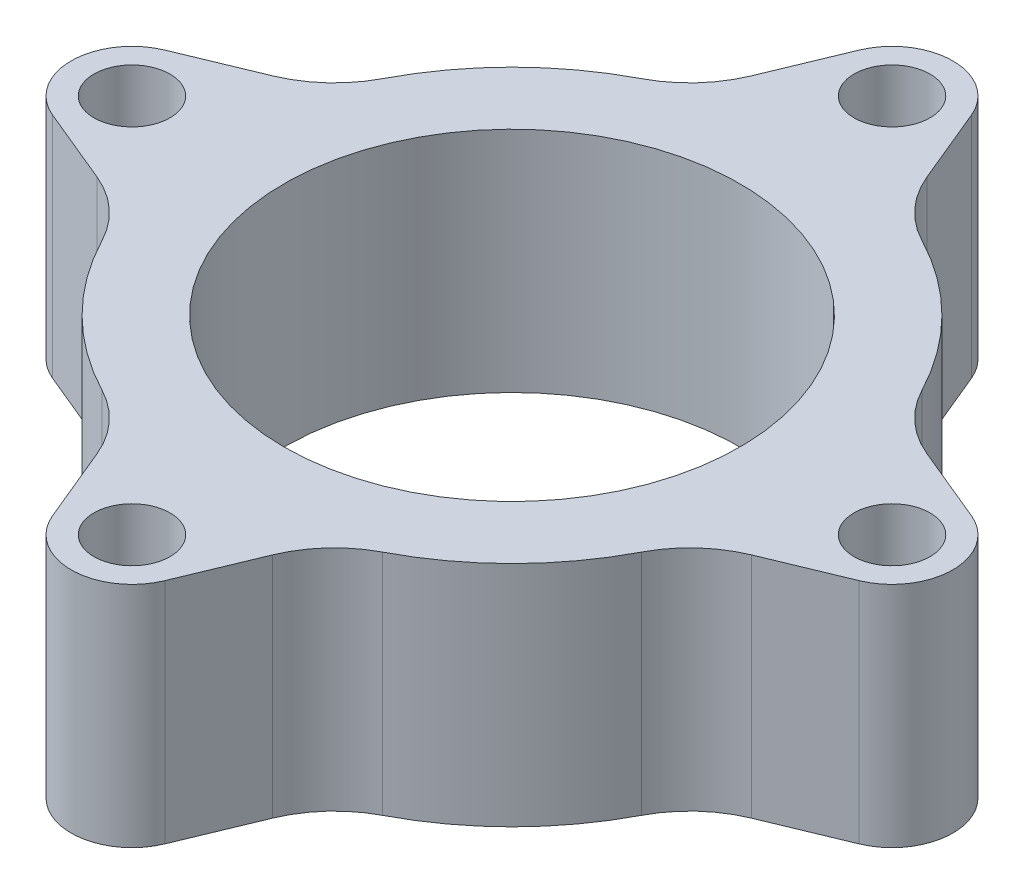
ISO-10303-21;
HEADER;
FILE_DESCRIPTION(('STEP AP214'),'2;1');
FILE_NAME('part.step','',(''),(''),'','','');
FILE_SCHEMA(('AUTOMOTIVE_DESIGN { 1 0 10303 214 1 1 1 1 }'));
ENDSEC;
DATA;
#1=APPLICATION_CONTEXT('core data for automotive mechanical design processes');
#2=APPLICATION_PROTOCOL_DEFINITION('international standard','automotive_design',2000,#1);
#3=PRODUCT_CONTEXT('',#1,'mechanical');
#4=PRODUCT('Part','Part','',(#3));
#5=PRODUCT_RELATED_PRODUCT_CATEGORY('part','',(#4));
#6=PRODUCT_DEFINITION_FORMATION('','',#4);
#7=PRODUCT_DEFINITION_CONTEXT('part definition',#1,'design');
#8=PRODUCT_DEFINITION('design','',#6,#7);
#9=PRODUCT_DEFINITION_SHAPE('','',#8);
#10=(LENGTH_UNIT() NAMED_UNIT(*) SI_UNIT(.MILLI.,.METRE.));
#11=(NAMED_UNIT(*) PLANE_ANGLE_UNIT() SI_UNIT($,.RADIAN.));
#12=(NAMED_UNIT(*) SI_UNIT($,.STERADIAN.) SOLID_ANGLE_UNIT());
#13=UNCERTAINTY_MEASURE_WITH_UNIT(LENGTH_MEASURE(1.E-05),#10,'distance_accuracy_value','');
#14=(GEOMETRIC_REPRESENTATION_CONTEXT(3) GLOBAL_UNCERTAINTY_ASSIGNED_CONTEXT((#13)) GLOBAL_UNIT_ASSIGNED_CONTEXT((#10,
#11,#12)) REPRESENTATION_CONTEXT('',''));
#15=CARTESIAN_POINT('',(0.,0.,0.));
#16=DIRECTION('',(0.,0.,1.));
#17=DIRECTION('',(1.,0.,0.));
#18=AXIS2_PLACEMENT_3D('',#15,#16,#17);
#19=CARTESIAN_POINT('',(0.,15.,0.));
#20=DIRECTION('',(0.,-1.,0.));
#21=DIRECTION('',(0.,0.,-1.));
#22=AXIS2_PLACEMENT_3D('',#19,#20,#21);
#23=CYLINDRICAL_SURFACE('',#22,40.);
#24=CARTESIAN_POINT('',(0.,-15.,0.));
#25=DIRECTION('',(0.,1.,0.));
#26=DIRECTION('',(0.,0.,1.));
#27=AXIS2_PLACEMENT_3D('',#24,#25,#26);
#28=CIRCLE('',#27,40.);
#29=CARTESIAN_POINT('',(-35.4795308778481,-15.,18.4716780149457));
#30=VERTEX_POINT('',#29);
#31=CARTESIAN_POINT('',(-18.4716780149456,-15.,35.4795308778481));
#32=VERTEX_POINT('',#31);
#33=EDGE_CURVE('E701',#30,#32,#28,.T.);
#34=ORIENTED_EDGE('',*,*,#33,.T.);
#35=DIRECTION('',(0.,-1.,0.));
#36=VECTOR('',#35,1.);
#37=CARTESIAN_POINT('',(-18.4716780149456,15.,35.4795308778481));
#38=LINE('',#37,#36);
#39=CARTESIAN_POINT('',(-18.4716780149456,15.,35.4795308778481));
#40=VERTEX_POINT('',#39);
#41=EDGE_CURVE('E809',#32,#40,#38,.F.);
#42=ORIENTED_EDGE('',*,*,#41,.T.);
#43=CARTESIAN_POINT('',(0.,15.,0.));
#44=DIRECTION('',(0.,1.,0.));
#45=DIRECTION('',(0.,0.,1.));
#46=AXIS2_PLACEMENT_3D('',#43,#44,#45);
#47=CIRCLE('',#46,40.);
#48=CARTESIAN_POINT('',(-35.4795308778481,15.,18.4716780149457));
#49=VERTEX_POINT('',#48);
#50=EDGE_CURVE('E663',#49,#40,#47,.T.);
#51=ORIENTED_EDGE('',*,*,#50,.F.);
#52=DIRECTION('',(0.,-1.,0.));
#53=VECTOR('',#52,1.);
#54=CARTESIAN_POINT('',(-35.4795308778481,15.,18.4716780149457));
#55=LINE('',#54,#53);
#56=EDGE_CURVE('E806',#49,#30,#55,.T.);
#57=ORIENTED_EDGE('',*,*,#56,.T.);
#58=EDGE_LOOP('',(#34,#42,#51,#57));
#59=FACE_BOUND('',#58,.T.);
#60=ADVANCED_FACE('F471',(#59),#23,.T.);
#61=CARTESIAN_POINT('',(-25.068705789754,15.,10.3837979292571));
#62=DIRECTION('',(-0.923879532511286,0.,0.382683432365091));
#63=DIRECTION('',(0.382683432365091,0.,0.923879532511287));
#64=AXIS2_PLACEMENT_3D('',#61,#62,#63);
#65=PLANE('',#64);
#66=DIRECTION('',(-0.382683432365091,0.,-0.923879532511287));
#67=VECTOR('',#66,1.);
#68=CARTESIAN_POINT('',(-25.068705789754,15.,10.3837979292571));
#69=LINE('',#68,#67);
#70=CARTESIAN_POINT('',(-7.39103626009029,15.,53.0614674589207));
#71=VERTEX_POINT('',#70);
#72=CARTESIAN_POINT('',(-11.540364282881,15.,43.0441034715647));
#73=VERTEX_POINT('',#72);
#74=EDGE_CURVE('E637',#71,#73,#69,.T.);
#75=ORIENTED_EDGE('',*,*,#74,.T.);
#76=DIRECTION('',(0.,-1.,0.));
#77=VECTOR('',#76,1.);
#78=CARTESIAN_POINT('',(-11.540364282881,15.,43.0441034715647));
#79=LINE('',#78,#77);
#80=CARTESIAN_POINT('',(-11.540364282881,-15.,43.0441034715647));
#81=VERTEX_POINT('',#80);
#82=EDGE_CURVE('E804',#73,#81,#79,.T.);
#83=ORIENTED_EDGE('',*,*,#82,.T.);
#84=DIRECTION('',(-0.382683432365091,0.,-0.923879532511287));
#85=VECTOR('',#84,1.);
#86=CARTESIAN_POINT('',(-25.068705789754,-15.,10.3837979292571));
#87=LINE('',#86,#85);
#88=CARTESIAN_POINT('',(-7.39103626009029,-15.,53.0614674589207));
#89=VERTEX_POINT('',#88);
#90=EDGE_CURVE('E640',#89,#81,#87,.T.);
#91=ORIENTED_EDGE('',*,*,#90,.F.);
#92=DIRECTION('',(0.,-1.,0.));
#93=VECTOR('',#92,1.);
#94=CARTESIAN_POINT('',(-7.39103626009029,15.,53.0614674589207));
#95=LINE('',#94,#93);
#96=EDGE_CURVE('E632',#71,#89,#95,.T.);
#97=ORIENTED_EDGE('',*,*,#96,.F.);
#98=EDGE_LOOP('',(#75,#83,#91,#97));
#99=FACE_BOUND('',#98,.T.);
#100=ADVANCED_FACE('F634',(#99),#65,.T.);
#101=CARTESIAN_POINT('',(25.068705789754,15.,10.3837979292571));
#102=DIRECTION('',(-0.923879532511287,0.,-0.38268343236509));
#103=DIRECTION('',(-0.38268343236509,0.,0.923879532511287));
#104=AXIS2_PLACEMENT_3D('',#101,#102,#103);
#105=PLANE('',#104);
#106=DIRECTION('',(0.38268343236509,0.,-0.923879532511287));
#107=VECTOR('',#106,1.);
#108=CARTESIAN_POINT('',(25.068705789754,-15.,10.3837979292571));
#109=LINE('',#108,#107);
#110=CARTESIAN_POINT('',(7.39103626009029,-15.,53.0614674589207));
#111=VERTEX_POINT('',#110);
#112=CARTESIAN_POINT('',(11.540364282881,-15.,43.0441034715647));
#113=VERTEX_POINT('',#112);
#114=EDGE_CURVE('E705',#111,#113,#109,.T.);
#115=ORIENTED_EDGE('',*,*,#114,.T.);
#116=DIRECTION('',(0.,1.,0.));
#117=VECTOR('',#116,1.);
#118=CARTESIAN_POINT('',(11.540364282881,15.,43.0441034715647));
#119=LINE('',#118,#117);
#120=CARTESIAN_POINT('',(11.540364282881,15.,43.0441034715647));
#121=VERTEX_POINT('',#120);
#122=EDGE_CURVE('E802',#113,#121,#119,.T.);
#123=ORIENTED_EDGE('',*,*,#122,.T.);
#124=DIRECTION('',(0.38268343236509,0.,-0.923879532511287));
#125=VECTOR('',#124,1.);
#126=CARTESIAN_POINT('',(25.068705789754,15.,10.3837979292571));
#127=LINE('',#126,#125);
#128=CARTESIAN_POINT('',(7.39103626009029,15.,53.0614674589207));
#129=VERTEX_POINT('',#128);
#130=EDGE_CURVE('E662',#129,#121,#127,.T.);
#131=ORIENTED_EDGE('',*,*,#130,.F.);
#132=DIRECTION('',(0.,-1.,0.));
#133=VECTOR('',#132,1.);
#134=CARTESIAN_POINT('',(7.39103626009029,15.,53.0614674589207));
#135=LINE('',#134,#133);
#136=EDGE_CURVE('E645',#129,#111,#135,.T.);
#137=ORIENTED_EDGE('',*,*,#136,.T.);
#138=EDGE_LOOP('',(#115,#123,#131,#137));
#139=FACE_BOUND('',#138,.T.);
#140=ADVANCED_FACE('F919',(#139),#105,.F.);
#141=CARTESIAN_POINT('',(0.,15.,0.));
#142=DIRECTION('',(0.,-1.,0.));
#143=DIRECTION('',(0.,0.,-1.));
#144=AXIS2_PLACEMENT_3D('',#141,#142,#143);
#145=CYLINDRICAL_SURFACE('',#144,40.);
#146=CARTESIAN_POINT('',(0.,-15.,0.));
#147=DIRECTION('',(0.,1.,0.));
#148=DIRECTION('',(0.,0.,1.));
#149=AXIS2_PLACEMENT_3D('',#146,#147,#148);
#150=CIRCLE('',#149,40.);
#151=CARTESIAN_POINT('',(18.4716780149457,-15.,35.479530877848));
#152=VERTEX_POINT('',#151);
#153=CARTESIAN_POINT('',(35.4795308778481,-15.,18.4716780149457));
#154=VERTEX_POINT('',#153);
#155=EDGE_CURVE('E708',#152,#154,#150,.T.);
#156=ORIENTED_EDGE('',*,*,#155,.T.);
#157=DIRECTION('',(0.,-1.,0.));
#158=VECTOR('',#157,1.);
#159=CARTESIAN_POINT('',(35.4795308778481,15.,18.4716780149457));
#160=LINE('',#159,#158);
#161=CARTESIAN_POINT('',(35.4795308778481,15.,18.4716780149457));
#162=VERTEX_POINT('',#161);
#163=EDGE_CURVE('E800',#154,#162,#160,.F.);
#164=ORIENTED_EDGE('',*,*,#163,.T.);
#165=CARTESIAN_POINT('',(0.,15.,0.));
#166=DIRECTION('',(0.,1.,0.));
#167=DIRECTION('',(0.,0.,1.));
#168=AXIS2_PLACEMENT_3D('',#165,#166,#167);
#169=CIRCLE('',#168,40.);
#170=CARTESIAN_POINT('',(18.4716780149457,15.,35.479530877848));
#171=VERTEX_POINT('',#170);
#172=EDGE_CURVE('E665',#171,#162,#169,.T.);
#173=ORIENTED_EDGE('',*,*,#172,.F.);
#174=DIRECTION('',(0.,-1.,0.));
#175=VECTOR('',#174,1.);
#176=CARTESIAN_POINT('',(18.4716780149457,15.,35.4795308778481));
#177=LINE('',#176,#175);
#178=EDGE_CURVE('E797',#171,#152,#177,.T.);
#179=ORIENTED_EDGE('',*,*,#178,.T.);
#180=EDGE_LOOP('',(#156,#164,#173,#179));
#181=FACE_BOUND('',#180,.T.);
#182=ADVANCED_FACE('F910',(#181),#145,.T.);
#183=CARTESIAN_POINT('',(10.3837979292571,15.,25.068705789754));
#184=DIRECTION('',(0.382683432365091,0.,0.923879532511286));
#185=DIRECTION('',(0.923879532511287,0.,-0.382683432365091));
#186=AXIS2_PLACEMENT_3D('',#183,#184,#185);
#187=PLANE('',#186);
#188=DIRECTION('',(-0.923879532511287,0.,0.382683432365091));
#189=VECTOR('',#188,1.);
#190=CARTESIAN_POINT('',(10.3837979292571,15.,25.068705789754));
#191=LINE('',#190,#189);
#192=CARTESIAN_POINT('',(53.0614674589207,15.,7.39103626009029));
#193=VERTEX_POINT('',#192);
#194=CARTESIAN_POINT('',(43.0441034715647,15.,11.540364282881));
#195=VERTEX_POINT('',#194);
#196=EDGE_CURVE('E673',#193,#195,#191,.T.);
#197=ORIENTED_EDGE('',*,*,#196,.T.);
#198=DIRECTION('',(0.,-1.,0.));
#199=VECTOR('',#198,1.);
#200=CARTESIAN_POINT('',(43.0441034715647,15.,11.540364282881));
#201=LINE('',#200,#199);
#202=CARTESIAN_POINT('',(43.0441034715647,-15.,11.540364282881));
#203=VERTEX_POINT('',#202);
#204=EDGE_CURVE('E794',#195,#203,#201,.T.);
#205=ORIENTED_EDGE('',*,*,#204,.T.);
#206=DIRECTION('',(-0.923879532511287,0.,0.382683432365091));
#207=VECTOR('',#206,1.);
#208=CARTESIAN_POINT('',(10.3837979292571,-15.,25.068705789754));
#209=LINE('',#208,#207);
#210=CARTESIAN_POINT('',(53.0614674589207,-15.,7.39103626009029));
#211=VERTEX_POINT('',#210);
#212=EDGE_CURVE('E711',#211,#203,#209,.T.);
#213=ORIENTED_EDGE('',*,*,#212,.F.);
#214=DIRECTION('',(0.,-1.,0.));
#215=VECTOR('',#214,1.);
#216=CARTESIAN_POINT('',(53.0614674589207,15.,7.39103626009029));
#217=LINE('',#216,#215);
#218=EDGE_CURVE('E741',#193,#211,#217,.T.);
#219=ORIENTED_EDGE('',*,*,#218,.F.);
#220=EDGE_LOOP('',(#197,#205,#213,#219));
#221=FACE_BOUND('',#220,.T.);
#222=ADVANCED_FACE('F901',(#221),#187,.T.);
#223=CARTESIAN_POINT('',(10.3837979292571,15.,-25.068705789754));
#224=DIRECTION('',(-0.38268343236509,0.,0.923879532511287));
#225=DIRECTION('',(0.923879532511287,0.,0.38268343236509));
#226=AXIS2_PLACEMENT_3D('',#223,#224,#225);
#227=PLANE('',#226);
#228=DIRECTION('',(-0.923879532511287,0.,-0.38268343236509));
#229=VECTOR('',#228,1.);
#230=CARTESIAN_POINT('',(10.3837979292571,-15.,-25.068705789754));
#231=LINE('',#230,#229);
#232=CARTESIAN_POINT('',(53.0614674589207,-15.,-7.39103626009029));
#233=VERTEX_POINT('',#232);
#234=CARTESIAN_POINT('',(43.0441034715647,-15.,-11.540364282881));
#235=VERTEX_POINT('',#234);
#236=EDGE_CURVE('E714',#233,#235,#231,.T.);
#237=ORIENTED_EDGE('',*,*,#236,.T.);
#238=DIRECTION('',(0.,1.,0.));
#239=VECTOR('',#238,1.);
#240=CARTESIAN_POINT('',(43.0441034715647,15.,-11.540364282881));
#241=LINE('',#240,#239);
#242=CARTESIAN_POINT('',(43.0441034715647,15.,-11.540364282881));
#243=VERTEX_POINT('',#242);
#244=EDGE_CURVE('E792',#235,#243,#241,.T.);
#245=ORIENTED_EDGE('',*,*,#244,.T.);
#246=DIRECTION('',(-0.923879532511287,0.,-0.38268343236509));
#247=VECTOR('',#246,1.);
#248=CARTESIAN_POINT('',(10.3837979292571,15.,-25.068705789754));
#249=LINE('',#248,#247);
#250=CARTESIAN_POINT('',(53.0614674589207,15.,-7.39103626009029));
#251=VERTEX_POINT('',#250);
#252=EDGE_CURVE('E676',#251,#243,#249,.T.);
#253=ORIENTED_EDGE('',*,*,#252,.F.);
#254=DIRECTION('',(0.,-1.,0.));
#255=VECTOR('',#254,1.);
#256=CARTESIAN_POINT('',(53.0614674589207,15.,-7.39103626009029));
#257=LINE('',#256,#255);
#258=EDGE_CURVE('E739',#251,#233,#257,.T.);
#259=ORIENTED_EDGE('',*,*,#258,.T.);
#260=EDGE_LOOP('',(#237,#245,#253,#259));
#261=FACE_BOUND('',#260,.T.);
#262=ADVANCED_FACE('F894',(#261),#227,.F.);
#263=CARTESIAN_POINT('',(0.,15.,0.));
#264=DIRECTION('',(0.,-1.,0.));
#265=DIRECTION('',(0.,0.,-1.));
#266=AXIS2_PLACEMENT_3D('',#263,#264,#265);
#267=CYLINDRICAL_SURFACE('',#266,40.);
#268=CARTESIAN_POINT('',(0.,-15.,0.));
#269=DIRECTION('',(0.,1.,0.));
#270=DIRECTION('',(0.,0.,1.));
#271=AXIS2_PLACEMENT_3D('',#268,#269,#270);
#272=CIRCLE('',#271,40.);
#273=CARTESIAN_POINT('',(35.4795308778481,-15.,-18.4716780149457));
#274=VERTEX_POINT('',#273);
#275=CARTESIAN_POINT('',(18.4716780149457,-15.,-35.4795308778481));
#276=VERTEX_POINT('',#275);
#277=EDGE_CURVE('E717',#274,#276,#272,.T.);
#278=ORIENTED_EDGE('',*,*,#277,.T.);
#279=DIRECTION('',(0.,-1.,0.));
#280=VECTOR('',#279,1.);
#281=CARTESIAN_POINT('',(18.4716780149457,15.,-35.4795308778481));
#282=LINE('',#281,#280);
#283=CARTESIAN_POINT('',(18.4716780149457,15.,-35.4795308778481));
#284=VERTEX_POINT('',#283);
#285=EDGE_CURVE('E790',#276,#284,#282,.F.);
#286=ORIENTED_EDGE('',*,*,#285,.T.);
#287=CARTESIAN_POINT('',(0.,15.,0.));
#288=DIRECTION('',(0.,1.,0.));
#289=DIRECTION('',(0.,0.,1.));
#290=AXIS2_PLACEMENT_3D('',#287,#288,#289);
#291=CIRCLE('',#290,40.);
#292=CARTESIAN_POINT('',(35.4795308778481,15.,-18.4716780149457));
#293=VERTEX_POINT('',#292);
#294=EDGE_CURVE('E679',#293,#284,#291,.T.);
#295=ORIENTED_EDGE('',*,*,#294,.F.);
#296=DIRECTION('',(0.,-1.,0.));
#297=VECTOR('',#296,1.);
#298=CARTESIAN_POINT('',(35.4795308778481,15.,-18.4716780149457));
#299=LINE('',#298,#297);
#300=EDGE_CURVE('E787',#293,#274,#299,.T.);
#301=ORIENTED_EDGE('',*,*,#300,.T.);
#302=EDGE_LOOP('',(#278,#286,#295,#301));
#303=FACE_BOUND('',#302,.T.);
#304=ADVANCED_FACE('F884',(#303),#267,.T.);
#305=CARTESIAN_POINT('',(25.068705789754,15.,-10.3837979292571));
#306=DIRECTION('',(0.923879532511286,0.,-0.382683432365091));
#307=DIRECTION('',(-0.382683432365091,0.,-0.923879532511286));
#308=AXIS2_PLACEMENT_3D('',#305,#306,#307);
#309=PLANE('',#308);
#310=DIRECTION('',(0.382683432365091,0.,0.923879532511286));
#311=VECTOR('',#310,1.);
#312=CARTESIAN_POINT('',(25.068705789754,15.,-10.3837979292571));
#313=LINE('',#312,#311);
#314=CARTESIAN_POINT('',(7.39103626009029,15.,-53.0614674589207));
#315=VERTEX_POINT('',#314);
#316=CARTESIAN_POINT('',(11.540364282881,15.,-43.0441034715647));
#317=VERTEX_POINT('',#316);
#318=EDGE_CURVE('E682',#315,#317,#313,.T.);
#319=ORIENTED_EDGE('',*,*,#318,.T.);
#320=DIRECTION('',(0.,-1.,0.));
#321=VECTOR('',#320,1.);
#322=CARTESIAN_POINT('',(11.540364282881,15.,-43.0441034715647));
#323=LINE('',#322,#321);
#324=CARTESIAN_POINT('',(11.540364282881,-15.,-43.0441034715647));
#325=VERTEX_POINT('',#324);
#326=EDGE_CURVE('E644',#317,#325,#323,.T.);
#327=ORIENTED_EDGE('',*,*,#326,.T.);
#328=DIRECTION('',(0.382683432365091,0.,0.923879532511286));
#329=VECTOR('',#328,1.);
#330=CARTESIAN_POINT('',(25.068705789754,-15.,-10.3837979292571));
#331=LINE('',#330,#329);
#332=CARTESIAN_POINT('',(7.39103626009029,-15.,-53.0614674589207));
#333=VERTEX_POINT('',#332);
#334=EDGE_CURVE('E720',#333,#325,#331,.T.);
#335=ORIENTED_EDGE('',*,*,#334,.F.);
#336=DIRECTION('',(0.,-1.,0.));
#337=VECTOR('',#336,1.);
#338=CARTESIAN_POINT('',(7.39103626009029,15.,-53.0614674589207));
#339=LINE('',#338,#337);
#340=EDGE_CURVE('E737',#315,#333,#339,.T.);
#341=ORIENTED_EDGE('',*,*,#340,.F.);
#342=EDGE_LOOP('',(#319,#327,#335,#341));
#343=FACE_BOUND('',#342,.T.);
#344=ADVANCED_FACE('F876',(#343),#309,.T.);
#345=CARTESIAN_POINT('',(-25.068705789754,15.,-10.3837979292571));
#346=DIRECTION('',(0.923879532511287,0.,0.38268343236509));
#347=DIRECTION('',(0.38268343236509,0.,-0.923879532511287));
#348=AXIS2_PLACEMENT_3D('',#345,#346,#347);
#349=PLANE('',#348);
#350=DIRECTION('',(-0.38268343236509,0.,0.923879532511287));
#351=VECTOR('',#350,1.);
#352=CARTESIAN_POINT('',(-25.068705789754,-15.,-10.3837979292571));
#353=LINE('',#352,#351);
#354=CARTESIAN_POINT('',(-7.39103626009029,-15.,-53.0614674589207));
#355=VERTEX_POINT('',#354);
#356=CARTESIAN_POINT('',(-11.540364282881,-15.,-43.0441034715647));
#357=VERTEX_POINT('',#356);
#358=EDGE_CURVE('E723',#355,#357,#353,.T.);
#359=ORIENTED_EDGE('',*,*,#358,.T.);
#360=DIRECTION('',(0.,1.,0.));
#361=VECTOR('',#360,1.);
#362=CARTESIAN_POINT('',(-11.540364282881,15.,-43.0441034715647));
#363=LINE('',#362,#361);
#364=CARTESIAN_POINT('',(-11.540364282881,15.,-43.0441034715647));
#365=VERTEX_POINT('',#364);
#366=EDGE_CURVE('E486',#357,#365,#363,.T.);
#367=ORIENTED_EDGE('',*,*,#366,.T.);
#368=DIRECTION('',(-0.38268343236509,0.,0.923879532511287));
#369=VECTOR('',#368,1.);
#370=CARTESIAN_POINT('',(-25.068705789754,15.,-10.3837979292571));
#371=LINE('',#370,#369);
#372=CARTESIAN_POINT('',(-7.39103626009029,15.,-53.0614674589207));
#373=VERTEX_POINT('',#372);
#374=EDGE_CURVE('E685',#373,#365,#371,.T.);
#375=ORIENTED_EDGE('',*,*,#374,.F.);
#376=DIRECTION('',(0.,-1.,0.));
#377=VECTOR('',#376,1.);
#378=CARTESIAN_POINT('',(-7.39103626009029,15.,-53.0614674589207));
#379=LINE('',#378,#377);
#380=EDGE_CURVE('E735',#373,#355,#379,.T.);
#381=ORIENTED_EDGE('',*,*,#380,.T.);
#382=EDGE_LOOP('',(#359,#367,#375,#381));
#383=FACE_BOUND('',#382,.T.);
#384=ADVANCED_FACE('F870',(#383),#349,.F.);
#385=CARTESIAN_POINT('',(0.,15.,0.));
#386=DIRECTION('',(0.,-1.,0.));
#387=DIRECTION('',(0.,0.,-1.));
#388=AXIS2_PLACEMENT_3D('',#385,#386,#387);
#389=CYLINDRICAL_SURFACE('',#388,40.);
#390=CARTESIAN_POINT('',(0.,-15.,0.));
#391=DIRECTION('',(0.,1.,0.));
#392=DIRECTION('',(0.,0.,1.));
#393=AXIS2_PLACEMENT_3D('',#390,#391,#392);
#394=CIRCLE('',#393,40.);
#395=CARTESIAN_POINT('',(-18.4716780149457,-15.,-35.479530877848));
#396=VERTEX_POINT('',#395);
#397=CARTESIAN_POINT('',(-35.479530877848,-15.,-18.4716780149457));
#398=VERTEX_POINT('',#397);
#399=EDGE_CURVE('E725',#396,#398,#394,.T.);
#400=ORIENTED_EDGE('',*,*,#399,.T.);
#401=DIRECTION('',(0.,-1.,0.));
#402=VECTOR('',#401,1.);
#403=CARTESIAN_POINT('',(-35.479530877848,15.,-18.4716780149457));
#404=LINE('',#403,#402);
#405=CARTESIAN_POINT('',(-35.479530877848,15.,-18.4716780149457));
#406=VERTEX_POINT('',#405);
#407=EDGE_CURVE('E819',#398,#406,#404,.F.);
#408=ORIENTED_EDGE('',*,*,#407,.T.);
#409=CARTESIAN_POINT('',(0.,15.,0.));
#410=DIRECTION('',(0.,1.,0.));
#411=DIRECTION('',(0.,0.,1.));
#412=AXIS2_PLACEMENT_3D('',#409,#410,#411);
#413=CIRCLE('',#412,40.);
#414=CARTESIAN_POINT('',(-18.4716780149457,15.,-35.479530877848));
#415=VERTEX_POINT('',#414);
#416=EDGE_CURVE('E687',#415,#406,#413,.T.);
#417=ORIENTED_EDGE('',*,*,#416,.F.);
#418=DIRECTION('',(0.,-1.,0.));
#419=VECTOR('',#418,1.);
#420=CARTESIAN_POINT('',(-18.4716780149457,15.,-35.479530877848));
#421=LINE('',#420,#419);
#422=EDGE_CURVE('E816',#415,#396,#421,.T.);
#423=ORIENTED_EDGE('',*,*,#422,.T.);
#424=EDGE_LOOP('',(#400,#408,#417,#423));
#425=FACE_BOUND('',#424,.T.);
#426=ADVANCED_FACE('F864',(#425),#389,.T.);
#427=CARTESIAN_POINT('',(-10.3837979292571,15.,-25.068705789754));
#428=DIRECTION('',(-0.382683432365091,0.,-0.923879532511286));
#429=DIRECTION('',(-0.923879532511286,0.,0.382683432365091));
#430=AXIS2_PLACEMENT_3D('',#427,#428,#429);
#431=PLANE('',#430);
#432=DIRECTION('',(0.923879532511286,0.,-0.382683432365091));
#433=VECTOR('',#432,1.);
#434=CARTESIAN_POINT('',(-10.3837979292571,15.,-25.068705789754));
#435=LINE('',#434,#433);
#436=CARTESIAN_POINT('',(-53.0614674589207,15.,-7.39103626009028));
#437=VERTEX_POINT('',#436);
#438=CARTESIAN_POINT('',(-43.0441034715647,15.,-11.540364282881));
#439=VERTEX_POINT('',#438);
#440=EDGE_CURVE('E690',#437,#439,#435,.T.);
#441=ORIENTED_EDGE('',*,*,#440,.T.);
#442=DIRECTION('',(0.,-1.,0.));
#443=VECTOR('',#442,1.);
#444=CARTESIAN_POINT('',(-43.0441034715647,15.,-11.540364282881));
#445=LINE('',#444,#443);
#446=CARTESIAN_POINT('',(-43.0441034715647,-15.,-11.540364282881));
#447=VERTEX_POINT('',#446);
#448=EDGE_CURVE('E813',#439,#447,#445,.T.);
#449=ORIENTED_EDGE('',*,*,#448,.T.);
#450=DIRECTION('',(0.923879532511286,0.,-0.382683432365091));
#451=VECTOR('',#450,1.);
#452=CARTESIAN_POINT('',(-10.3837979292571,-15.,-25.068705789754));
#453=LINE('',#452,#451);
#454=CARTESIAN_POINT('',(-53.0614674589207,-15.,-7.39103626009028));
#455=VERTEX_POINT('',#454);
#456=EDGE_CURVE('E728',#455,#447,#453,.T.);
#457=ORIENTED_EDGE('',*,*,#456,.F.);
#458=DIRECTION('',(0.,-1.,0.));
#459=VECTOR('',#458,1.);
#460=CARTESIAN_POINT('',(-53.0614674589207,15.,-7.39103626009028));
#461=LINE('',#460,#459);
#462=EDGE_CURVE('E733',#437,#455,#461,.T.);
#463=ORIENTED_EDGE('',*,*,#462,.F.);
#464=EDGE_LOOP('',(#441,#449,#457,#463));
#465=FACE_BOUND('',#464,.T.);
#466=ADVANCED_FACE('F855',(#465),#431,.T.);
#467=CARTESIAN_POINT('',(-10.3837979292571,15.,25.068705789754));
#468=DIRECTION('',(0.38268343236509,0.,-0.923879532511287));
#469=DIRECTION('',(-0.923879532511287,0.,-0.38268343236509));
#470=AXIS2_PLACEMENT_3D('',#467,#468,#469);
#471=PLANE('',#470);
#472=DIRECTION('',(0.923879532511287,0.,0.38268343236509));
#473=VECTOR('',#472,1.);
#474=CARTESIAN_POINT('',(-10.3837979292571,-15.,25.068705789754));
#475=LINE('',#474,#473);
#476=CARTESIAN_POINT('',(-53.0614674589207,-15.,7.39103626009029));
#477=VERTEX_POINT('',#476);
#478=CARTESIAN_POINT('',(-43.0441034715647,-15.,11.540364282881));
#479=VERTEX_POINT('',#478);
#480=EDGE_CURVE('E697',#477,#479,#475,.T.);
#481=ORIENTED_EDGE('',*,*,#480,.T.);
#482=DIRECTION('',(0.,1.,0.));
#483=VECTOR('',#482,1.);
#484=CARTESIAN_POINT('',(-43.0441034715647,15.,11.540364282881));
#485=LINE('',#484,#483);
#486=CARTESIAN_POINT('',(-43.0441034715647,15.,11.540364282881));
#487=VERTEX_POINT('',#486);
#488=EDGE_CURVE('E811',#479,#487,#485,.T.);
#489=ORIENTED_EDGE('',*,*,#488,.T.);
#490=DIRECTION('',(0.923879532511287,0.,0.38268343236509));
#491=VECTOR('',#490,1.);
#492=CARTESIAN_POINT('',(-10.3837979292571,15.,25.068705789754));
#493=LINE('',#492,#491);
#494=CARTESIAN_POINT('',(-53.0614674589207,15.,7.39103626009029));
#495=VERTEX_POINT('',#494);
#496=EDGE_CURVE('E667',#495,#487,#493,.T.);
#497=ORIENTED_EDGE('',*,*,#496,.F.);
#498=DIRECTION('',(0.,-1.,0.));
#499=VECTOR('',#498,1.);
#500=CARTESIAN_POINT('',(-53.0614674589207,15.,7.39103626009029));
#501=LINE('',#500,#499);
#502=EDGE_CURVE('E693',#495,#477,#501,.T.);
#503=ORIENTED_EDGE('',*,*,#502,.T.);
#504=EDGE_LOOP('',(#481,#489,#497,#503));
#505=FACE_BOUND('',#504,.T.);
#506=ADVANCED_FACE('F945',(#505),#471,.F.);
#507=CARTESIAN_POINT('',(0.,15.,0.));
#508=DIRECTION('',(0.,-1.,0.));
#509=DIRECTION('',(0.,0.,-1.));
#510=AXIS2_PLACEMENT_3D('',#507,#508,#509);
#511=CYLINDRICAL_SURFACE('',#510,30.);
#512=CARTESIAN_POINT('',(0.,15.,0.));
#513=DIRECTION('',(0.,1.,0.));
#514=DIRECTION('',(0.,0.,1.));
#515=AXIS2_PLACEMENT_3D('',#512,#513,#514);
#516=CIRCLE('',#515,30.);
#517=CARTESIAN_POINT('',(0.,15.,30.));
#518=VERTEX_POINT('',#517);
#519=EDGE_CURVE('E731',#518,#518,#516,.T.);
#520=ORIENTED_EDGE('',*,*,#519,.T.);
#521=EDGE_LOOP('',(#520));
#522=FACE_BOUND('',#521,.T.);
#523=CARTESIAN_POINT('',(0.,-15.,0.));
#524=DIRECTION('',(0.,1.,0.));
#525=DIRECTION('',(0.,0.,1.));
#526=AXIS2_PLACEMENT_3D('',#523,#524,#525);
#527=CIRCLE('',#526,30.);
#528=CARTESIAN_POINT('',(0.,-15.,30.));
#529=VERTEX_POINT('',#528);
#530=EDGE_CURVE('E694',#529,#529,#527,.T.);
#531=ORIENTED_EDGE('',*,*,#530,.F.);
#532=EDGE_LOOP('',(#531));
#533=FACE_BOUND('',#532,.T.);
#534=ADVANCED_FACE('F948',(#522,#533),#511,.F.);
#535=CARTESIAN_POINT('',(0.,-15.,0.));
#536=DIRECTION('',(0.,1.,0.));
#537=DIRECTION('',(0.,0.,1.));
#538=AXIS2_PLACEMENT_3D('',#535,#536,#537);
#539=PLANE('',#538);
#540=ORIENTED_EDGE('',*,*,#530,.T.);
#541=EDGE_LOOP('',(#540));
#542=FACE_BOUND('',#541,.T.);
#543=ORIENTED_EDGE('',*,*,#480,.F.);
#544=CARTESIAN_POINT('',(-50.,-15.,0.));
#545=DIRECTION('',(0.,1.,0.));
#546=DIRECTION('',(0.,0.,1.));
#547=AXIS2_PLACEMENT_3D('',#544,#545,#546);
#548=CIRCLE('',#547,8.0000000000005);
#549=EDGE_CURVE('E747',#455,#477,#548,.T.);
#550=ORIENTED_EDGE('',*,*,#549,.F.);
#551=ORIENTED_EDGE('',*,*,#456,.T.);
#552=CARTESIAN_POINT('',(-48.784354957041,-15.,-25.3985572705503));
#553=DIRECTION('',(0.,1.,0.));
#554=DIRECTION('',(0.,0.,1.));
#555=AXIS2_PLACEMENT_3D('',#552,#553,#554);
#556=CIRCLE('',#555,15.);
#557=EDGE_CURVE('E845',#447,#398,#556,.T.);
#558=ORIENTED_EDGE('',*,*,#557,.T.);
#559=ORIENTED_EDGE('',*,*,#399,.F.);
#560=CARTESIAN_POINT('',(-25.3985572705503,-15.,-48.7843549570411));
#561=DIRECTION('',(0.,1.,0.));
#562=DIRECTION('',(0.,0.,1.));
#563=AXIS2_PLACEMENT_3D('',#560,#561,#562);
#564=CIRCLE('',#563,15.);
#565=EDGE_CURVE('E479',#396,#357,#564,.T.);
#566=ORIENTED_EDGE('',*,*,#565,.T.);
#567=ORIENTED_EDGE('',*,*,#358,.F.);
#568=CARTESIAN_POINT('',(0.,-15.,-50.));
#569=DIRECTION('',(0.,1.,0.));
#570=DIRECTION('',(0.,0.,1.));
#571=AXIS2_PLACEMENT_3D('',#568,#569,#570);
#572=CIRCLE('',#571,8.);
#573=EDGE_CURVE('E759',#333,#355,#572,.T.);
#574=ORIENTED_EDGE('',*,*,#573,.F.);
#575=ORIENTED_EDGE('',*,*,#334,.T.);
#576=CARTESIAN_POINT('',(25.3985572705503,-15.,-48.7843549570411));
#577=DIRECTION('',(0.,1.,0.));
#578=DIRECTION('',(0.,0.,1.));
#579=AXIS2_PLACEMENT_3D('',#576,#577,#578);
#580=CIRCLE('',#579,15.);
#581=EDGE_CURVE('E822',#325,#276,#580,.T.);
#582=ORIENTED_EDGE('',*,*,#581,.T.);
#583=ORIENTED_EDGE('',*,*,#277,.F.);
#584=CARTESIAN_POINT('',(48.7843549570411,-15.,-25.3985572705503));
#585=DIRECTION('',(0.,1.,0.));
#586=DIRECTION('',(0.,0.,1.));
#587=AXIS2_PLACEMENT_3D('',#584,#585,#586);
#588=CIRCLE('',#587,15.);
#589=EDGE_CURVE('E826',#274,#235,#588,.T.);
#590=ORIENTED_EDGE('',*,*,#589,.T.);
#591=ORIENTED_EDGE('',*,*,#236,.F.);
#592=CARTESIAN_POINT('',(50.,-15.,0.));
#593=DIRECTION('',(0.,1.,0.));
#594=DIRECTION('',(0.,0.,1.));
#595=AXIS2_PLACEMENT_3D('',#592,#593,#594);
#596=CIRCLE('',#595,8.00000000000017);
#597=EDGE_CURVE('E771',#211,#233,#596,.T.);
#598=ORIENTED_EDGE('',*,*,#597,.F.);
#599=ORIENTED_EDGE('',*,*,#212,.T.);
#600=CARTESIAN_POINT('',(48.7843549570411,-15.,25.3985572705503));
#601=DIRECTION('',(0.,1.,0.));
#602=DIRECTION('',(0.,0.,1.));
#603=AXIS2_PLACEMENT_3D('',#600,#601,#602);
#604=CIRCLE('',#603,15.);
#605=EDGE_CURVE('E830',#203,#154,#604,.T.);
#606=ORIENTED_EDGE('',*,*,#605,.T.);
#607=ORIENTED_EDGE('',*,*,#155,.F.);
#608=CARTESIAN_POINT('',(25.3985572705503,-15.,48.7843549570411));
#609=DIRECTION('',(0.,1.,0.));
#610=DIRECTION('',(0.,0.,1.));
#611=AXIS2_PLACEMENT_3D('',#608,#609,#610);
#612=CIRCLE('',#611,15.);
#613=EDGE_CURVE('E834',#152,#113,#612,.T.);
#614=ORIENTED_EDGE('',*,*,#613,.T.);
#615=ORIENTED_EDGE('',*,*,#114,.F.);
#616=CARTESIAN_POINT('',(0.,-15.,50.));
#617=DIRECTION('',(0.,1.,0.));
#618=DIRECTION('',(0.,0.,1.));
#619=AXIS2_PLACEMENT_3D('',#616,#617,#618);
#620=CIRCLE('',#619,8.00000000000034);
#621=EDGE_CURVE('E654',#89,#111,#620,.T.);
#622=ORIENTED_EDGE('',*,*,#621,.F.);
#623=ORIENTED_EDGE('',*,*,#90,.T.);
#624=CARTESIAN_POINT('',(-25.3985572705503,-15.,48.7843549570411));
#625=DIRECTION('',(0.,1.,0.));
#626=DIRECTION('',(0.,0.,1.));
#627=AXIS2_PLACEMENT_3D('',#624,#625,#626);
#628=CIRCLE('',#627,15.);
#629=EDGE_CURVE('E838',#81,#32,#628,.T.);
#630=ORIENTED_EDGE('',*,*,#629,.T.);
#631=ORIENTED_EDGE('',*,*,#33,.F.);
#632=CARTESIAN_POINT('',(-48.7843549570411,-15.,25.3985572705503));
#633=DIRECTION('',(0.,1.,0.));
#634=DIRECTION('',(0.,0.,1.));
#635=AXIS2_PLACEMENT_3D('',#632,#633,#634);
#636=CIRCLE('',#635,15.);
#637=EDGE_CURVE('E841',#30,#479,#636,.T.);
#638=ORIENTED_EDGE('',*,*,#637,.T.);
#639=EDGE_LOOP('',(#543,#550,#551,#558,#559,#566,#567,#574,#575,#582,#583,#590,#591,#598,#599,
#606,#607,#614,#615,#622,#623,#630,#631,#638));
#640=FACE_BOUND('',#639,.T.);
#641=CARTESIAN_POINT('',(-50.,-15.,0.));
#642=DIRECTION('',(0.,1.,0.));
#643=DIRECTION('',(0.,0.,1.));
#644=AXIS2_PLACEMENT_3D('',#641,#642,#643);
#645=CIRCLE('',#644,5.00000000000051);
#646=CARTESIAN_POINT('',(-50.,-15.,5.00000000000051));
#647=VERTEX_POINT('',#646);
#648=EDGE_CURVE('E748',#647,#647,#645,.T.);
#649=ORIENTED_EDGE('',*,*,#648,.T.);
#650=EDGE_LOOP('',(#649));
#651=FACE_BOUND('',#650,.T.);
#652=CARTESIAN_POINT('',(0.,-15.,-50.));
#653=DIRECTION('',(0.,1.,0.));
#654=DIRECTION('',(0.,0.,1.));
#655=AXIS2_PLACEMENT_3D('',#652,#653,#654);
#656=CIRCLE('',#655,5.);
#657=CARTESIAN_POINT('',(0.,-15.,-45.));
#658=VERTEX_POINT('',#657);
#659=EDGE_CURVE('E760',#658,#658,#656,.T.);
#660=ORIENTED_EDGE('',*,*,#659,.T.);
#661=EDGE_LOOP('',(#660));
#662=FACE_BOUND('',#661,.T.);
#663=CARTESIAN_POINT('',(50.,-15.,0.));
#664=DIRECTION('',(0.,1.,0.));
#665=DIRECTION('',(0.,0.,1.));
#666=AXIS2_PLACEMENT_3D('',#663,#664,#665);
#667=CIRCLE('',#666,5.00000000000017);
#668=CARTESIAN_POINT('',(50.,-15.,5.00000000000017));
#669=VERTEX_POINT('',#668);
#670=EDGE_CURVE('E653',#669,#669,#667,.T.);
#671=ORIENTED_EDGE('',*,*,#670,.T.);
#672=EDGE_LOOP('',(#671));
#673=FACE_BOUND('',#672,.T.);
#674=CARTESIAN_POINT('',(0.,-15.,50.));
#675=DIRECTION('',(0.,1.,0.));
#676=DIRECTION('',(0.,0.,1.));
#677=AXIS2_PLACEMENT_3D('',#674,#675,#676);
#678=CIRCLE('',#677,5.00000000000034);
#679=CARTESIAN_POINT('',(0.,-15.,55.0000000000003));
#680=VERTEX_POINT('',#679);
#681=EDGE_CURVE('E781',#680,#680,#678,.T.);
#682=ORIENTED_EDGE('',*,*,#681,.T.);
#683=EDGE_LOOP('',(#682));
#684=FACE_BOUND('',#683,.T.);
#685=ADVANCED_FACE('F860',(#542,#640,#651,#662,#673,#684),#539,.F.);
#686=CARTESIAN_POINT('',(0.,15.,0.));
#687=DIRECTION('',(0.,1.,0.));
#688=DIRECTION('',(0.,0.,1.));
#689=AXIS2_PLACEMENT_3D('',#686,#687,#688);
#690=PLANE('',#689);
#691=ORIENTED_EDGE('',*,*,#519,.F.);
#692=EDGE_LOOP('',(#691));
#693=FACE_BOUND('',#692,.T.);
#694=ORIENTED_EDGE('',*,*,#496,.T.);
#695=CARTESIAN_POINT('',(-48.7843549570411,15.,25.3985572705503));
#696=DIRECTION('',(0.,1.,0.));
#697=DIRECTION('',(0.,0.,1.));
#698=AXIS2_PLACEMENT_3D('',#695,#696,#697);
#699=CIRCLE('',#698,15.);
#700=EDGE_CURVE('E843',#487,#49,#699,.F.);
#701=ORIENTED_EDGE('',*,*,#700,.T.);
#702=ORIENTED_EDGE('',*,*,#50,.T.);
#703=CARTESIAN_POINT('',(-25.3985572705503,15.,48.7843549570411));
#704=DIRECTION('',(0.,1.,0.));
#705=DIRECTION('',(0.,0.,1.));
#706=AXIS2_PLACEMENT_3D('',#703,#704,#705);
#707=CIRCLE('',#706,15.);
#708=EDGE_CURVE('E661',#40,#73,#707,.F.);
#709=ORIENTED_EDGE('',*,*,#708,.T.);
#710=ORIENTED_EDGE('',*,*,#74,.F.);
#711=CARTESIAN_POINT('',(0.,15.,50.));
#712=DIRECTION('',(0.,1.,0.));
#713=DIRECTION('',(0.,0.,1.));
#714=AXIS2_PLACEMENT_3D('',#711,#712,#713);
#715=CIRCLE('',#714,8.00000000000034);
#716=EDGE_CURVE('E648',#71,#129,#715,.T.);
#717=ORIENTED_EDGE('',*,*,#716,.T.);
#718=ORIENTED_EDGE('',*,*,#130,.T.);
#719=CARTESIAN_POINT('',(25.3985572705503,15.,48.7843549570411));
#720=DIRECTION('',(0.,1.,0.));
#721=DIRECTION('',(0.,0.,1.));
#722=AXIS2_PLACEMENT_3D('',#719,#720,#721);
#723=CIRCLE('',#722,15.);
#724=EDGE_CURVE('E836',#121,#171,#723,.F.);
#725=ORIENTED_EDGE('',*,*,#724,.T.);
#726=ORIENTED_EDGE('',*,*,#172,.T.);
#727=CARTESIAN_POINT('',(48.7843549570411,15.,25.3985572705503));
#728=DIRECTION('',(0.,1.,0.));
#729=DIRECTION('',(0.,0.,1.));
#730=AXIS2_PLACEMENT_3D('',#727,#728,#729);
#731=CIRCLE('',#730,15.);
#732=EDGE_CURVE('E832',#162,#195,#731,.F.);
#733=ORIENTED_EDGE('',*,*,#732,.T.);
#734=ORIENTED_EDGE('',*,*,#196,.F.);
#735=CARTESIAN_POINT('',(50.,15.,0.));
#736=DIRECTION('',(0.,1.,0.));
#737=DIRECTION('',(0.,0.,1.));
#738=AXIS2_PLACEMENT_3D('',#735,#736,#737);
#739=CIRCLE('',#738,8.00000000000017);
#740=EDGE_CURVE('E763',#193,#251,#739,.T.);
#741=ORIENTED_EDGE('',*,*,#740,.T.);
#742=ORIENTED_EDGE('',*,*,#252,.T.);
#743=CARTESIAN_POINT('',(48.7843549570411,15.,-25.3985572705503));
#744=DIRECTION('',(0.,1.,0.));
#745=DIRECTION('',(0.,0.,1.));
#746=AXIS2_PLACEMENT_3D('',#743,#744,#745);
#747=CIRCLE('',#746,15.);
#748=EDGE_CURVE('E828',#243,#293,#747,.F.);
#749=ORIENTED_EDGE('',*,*,#748,.T.);
#750=ORIENTED_EDGE('',*,*,#294,.T.);
#751=CARTESIAN_POINT('',(25.3985572705503,15.,-48.7843549570411));
#752=DIRECTION('',(0.,1.,0.));
#753=DIRECTION('',(0.,0.,1.));
#754=AXIS2_PLACEMENT_3D('',#751,#752,#753);
#755=CIRCLE('',#754,15.);
#756=EDGE_CURVE('E824',#284,#317,#755,.F.);
#757=ORIENTED_EDGE('',*,*,#756,.T.);
#758=ORIENTED_EDGE('',*,*,#318,.F.);
#759=CARTESIAN_POINT('',(0.,15.,-50.));
#760=DIRECTION('',(0.,1.,0.));
#761=DIRECTION('',(0.,0.,1.));
#762=AXIS2_PLACEMENT_3D('',#759,#760,#761);
#763=CIRCLE('',#762,8.);
#764=EDGE_CURVE('E751',#315,#373,#763,.T.);
#765=ORIENTED_EDGE('',*,*,#764,.T.);
#766=ORIENTED_EDGE('',*,*,#374,.T.);
#767=CARTESIAN_POINT('',(-25.3985572705503,15.,-48.7843549570411));
#768=DIRECTION('',(0.,1.,0.));
#769=DIRECTION('',(0.,0.,1.));
#770=AXIS2_PLACEMENT_3D('',#767,#768,#769);
#771=CIRCLE('',#770,15.);
#772=EDGE_CURVE('E12',#365,#415,#771,.F.);
#773=ORIENTED_EDGE('',*,*,#772,.T.);
#774=ORIENTED_EDGE('',*,*,#416,.T.);
#775=CARTESIAN_POINT('',(-48.784354957041,15.,-25.3985572705503));
#776=DIRECTION('',(0.,1.,0.));
#777=DIRECTION('',(0.,0.,1.));
#778=AXIS2_PLACEMENT_3D('',#775,#776,#777);
#779=CIRCLE('',#778,15.);
#780=EDGE_CURVE('E847',#406,#439,#779,.F.);
#781=ORIENTED_EDGE('',*,*,#780,.T.);
#782=ORIENTED_EDGE('',*,*,#440,.F.);
#783=CARTESIAN_POINT('',(-50.,15.,0.));
#784=DIRECTION('',(0.,1.,0.));
#785=DIRECTION('',(0.,0.,1.));
#786=AXIS2_PLACEMENT_3D('',#783,#784,#785);
#787=CIRCLE('',#786,8.0000000000005);
#788=EDGE_CURVE('E698',#437,#495,#787,.T.);
#789=ORIENTED_EDGE('',*,*,#788,.T.);
#790=EDGE_LOOP('',(#694,#701,#702,#709,#710,#717,#718,#725,#726,#733,#734,#741,#742,#749,#750,
#757,#758,#765,#766,#773,#774,#781,#782,#789));
#791=FACE_BOUND('',#790,.T.);
#792=CARTESIAN_POINT('',(-50.,15.,0.));
#793=DIRECTION('',(0.,1.,0.));
#794=DIRECTION('',(0.,0.,1.));
#795=AXIS2_PLACEMENT_3D('',#792,#793,#794);
#796=CIRCLE('',#795,5.00000000000051);
#797=CARTESIAN_POINT('',(-50.,15.,5.00000000000051));
#798=VERTEX_POINT('',#797);
#799=EDGE_CURVE('E744',#798,#798,#796,.T.);
#800=ORIENTED_EDGE('',*,*,#799,.F.);
#801=EDGE_LOOP('',(#800));
#802=FACE_BOUND('',#801,.T.);
#803=CARTESIAN_POINT('',(0.,15.,-50.));
#804=DIRECTION('',(0.,1.,0.));
#805=DIRECTION('',(0.,0.,1.));
#806=AXIS2_PLACEMENT_3D('',#803,#804,#805);
#807=CIRCLE('',#806,5.);
#808=CARTESIAN_POINT('',(0.,15.,-45.));
#809=VERTEX_POINT('',#808);
#810=EDGE_CURVE('E756',#809,#809,#807,.T.);
#811=ORIENTED_EDGE('',*,*,#810,.F.);
#812=EDGE_LOOP('',(#811));
#813=FACE_BOUND('',#812,.T.);
#814=CARTESIAN_POINT('',(50.,15.,0.));
#815=DIRECTION('',(0.,1.,0.));
#816=DIRECTION('',(0.,0.,1.));
#817=AXIS2_PLACEMENT_3D('',#814,#815,#816);
#818=CIRCLE('',#817,5.00000000000017);
#819=CARTESIAN_POINT('',(50.,15.,5.00000000000017));
#820=VERTEX_POINT('',#819);
#821=EDGE_CURVE('E768',#820,#820,#818,.T.);
#822=ORIENTED_EDGE('',*,*,#821,.F.);
#823=EDGE_LOOP('',(#822));
#824=FACE_BOUND('',#823,.T.);
#825=CARTESIAN_POINT('',(0.,15.,50.));
#826=DIRECTION('',(0.,1.,0.));
#827=DIRECTION('',(0.,0.,1.));
#828=AXIS2_PLACEMENT_3D('',#825,#826,#827);
#829=CIRCLE('',#828,5.00000000000034);
#830=CARTESIAN_POINT('',(0.,15.,55.0000000000003));
#831=VERTEX_POINT('',#830);
#832=EDGE_CURVE('E778',#831,#831,#829,.T.);
#833=ORIENTED_EDGE('',*,*,#832,.F.);
#834=EDGE_LOOP('',(#833));
#835=FACE_BOUND('',#834,.T.);
#836=ADVANCED_FACE('F657',(#693,#791,#802,#813,#824,#835),#690,.T.);
#837=CARTESIAN_POINT('',(0.,15.,50.));
#838=DIRECTION('',(0.,-1.,0.));
#839=DIRECTION('',(0.,0.,-1.));
#840=AXIS2_PLACEMENT_3D('',#837,#838,#839);
#841=CYLINDRICAL_SURFACE('',#840,5.00000000000034);
#842=ORIENTED_EDGE('',*,*,#832,.T.);
#843=EDGE_LOOP('',(#842));
#844=FACE_BOUND('',#843,.T.);
#845=ORIENTED_EDGE('',*,*,#681,.F.);
#846=EDGE_LOOP('',(#845));
#847=FACE_BOUND('',#846,.T.);
#848=ADVANCED_FACE('F973',(#844,#847),#841,.F.);
#849=CARTESIAN_POINT('',(0.,15.,50.));
#850=DIRECTION('',(0.,-1.,0.));
#851=DIRECTION('',(0.,0.,-1.));
#852=AXIS2_PLACEMENT_3D('',#849,#850,#851);
#853=CYLINDRICAL_SURFACE('',#852,8.00000000000034);
#854=ORIENTED_EDGE('',*,*,#716,.F.);
#855=ORIENTED_EDGE('',*,*,#96,.T.);
#856=ORIENTED_EDGE('',*,*,#621,.T.);
#857=ORIENTED_EDGE('',*,*,#136,.F.);
#858=EDGE_LOOP('',(#854,#855,#856,#857));
#859=FACE_BOUND('',#858,.T.);
#860=ADVANCED_FACE('F649',(#859),#853,.T.);
#861=CARTESIAN_POINT('',(50.,15.,0.));
#862=DIRECTION('',(0.,-1.,0.));
#863=DIRECTION('',(0.,0.,-1.));
#864=AXIS2_PLACEMENT_3D('',#861,#862,#863);
#865=CYLINDRICAL_SURFACE('',#864,5.00000000000017);
#866=ORIENTED_EDGE('',*,*,#821,.T.);
#867=EDGE_LOOP('',(#866));
#868=FACE_BOUND('',#867,.T.);
#869=ORIENTED_EDGE('',*,*,#670,.F.);
#870=EDGE_LOOP('',(#869));
#871=FACE_BOUND('',#870,.T.);
#872=ADVANCED_FACE('F967',(#868,#871),#865,.F.);
#873=CARTESIAN_POINT('',(50.,15.,0.));
#874=DIRECTION('',(0.,-1.,0.));
#875=DIRECTION('',(0.,0.,-1.));
#876=AXIS2_PLACEMENT_3D('',#873,#874,#875);
#877=CYLINDRICAL_SURFACE('',#876,8.00000000000017);
#878=ORIENTED_EDGE('',*,*,#740,.F.);
#879=ORIENTED_EDGE('',*,*,#218,.T.);
#880=ORIENTED_EDGE('',*,*,#597,.T.);
#881=ORIENTED_EDGE('',*,*,#258,.F.);
#882=EDGE_LOOP('',(#878,#879,#880,#881));
#883=FACE_BOUND('',#882,.T.);
#884=ADVANCED_FACE('F898',(#883),#877,.T.);
#885=CARTESIAN_POINT('',(0.,15.,-50.));
#886=DIRECTION('',(0.,-1.,0.));
#887=DIRECTION('',(0.,0.,-1.));
#888=AXIS2_PLACEMENT_3D('',#885,#886,#887);
#889=CYLINDRICAL_SURFACE('',#888,5.);
#890=ORIENTED_EDGE('',*,*,#810,.T.);
#891=EDGE_LOOP('',(#890));
#892=FACE_BOUND('',#891,.T.);
#893=ORIENTED_EDGE('',*,*,#659,.F.);
#894=EDGE_LOOP('',(#893));
#895=FACE_BOUND('',#894,.T.);
#896=ADVANCED_FACE('F961',(#892,#895),#889,.F.);
#897=CARTESIAN_POINT('',(0.,15.,-50.));
#898=DIRECTION('',(0.,-1.,0.));
#899=DIRECTION('',(0.,0.,-1.));
#900=AXIS2_PLACEMENT_3D('',#897,#898,#899);
#901=CYLINDRICAL_SURFACE('',#900,8.);
#902=ORIENTED_EDGE('',*,*,#764,.F.);
#903=ORIENTED_EDGE('',*,*,#340,.T.);
#904=ORIENTED_EDGE('',*,*,#573,.T.);
#905=ORIENTED_EDGE('',*,*,#380,.F.);
#906=EDGE_LOOP('',(#902,#903,#904,#905));
#907=FACE_BOUND('',#906,.T.);
#908=ADVANCED_FACE('F873',(#907),#901,.T.);
#909=CARTESIAN_POINT('',(-50.,15.,0.));
#910=DIRECTION('',(0.,-1.,0.));
#911=DIRECTION('',(0.,0.,-1.));
#912=AXIS2_PLACEMENT_3D('',#909,#910,#911);
#913=CYLINDRICAL_SURFACE('',#912,5.00000000000051);
#914=ORIENTED_EDGE('',*,*,#799,.T.);
#915=EDGE_LOOP('',(#914));
#916=FACE_BOUND('',#915,.T.);
#917=ORIENTED_EDGE('',*,*,#648,.F.);
#918=EDGE_LOOP('',(#917));
#919=FACE_BOUND('',#918,.T.);
#920=ADVANCED_FACE('F953',(#916,#919),#913,.F.);
#921=CARTESIAN_POINT('',(-50.,15.,0.));
#922=DIRECTION('',(0.,-1.,0.));
#923=DIRECTION('',(0.,0.,-1.));
#924=AXIS2_PLACEMENT_3D('',#921,#922,#923);
#925=CYLINDRICAL_SURFACE('',#924,8.0000000000005);
#926=ORIENTED_EDGE('',*,*,#502,.F.);
#927=ORIENTED_EDGE('',*,*,#788,.F.);
#928=ORIENTED_EDGE('',*,*,#462,.T.);
#929=ORIENTED_EDGE('',*,*,#549,.T.);
#930=EDGE_LOOP('',(#926,#927,#928,#929));
#931=FACE_BOUND('',#930,.T.);
#932=ADVANCED_FACE('F956',(#931),#925,.T.);
#933=CARTESIAN_POINT('',(25.3985572705503,15.,-48.7843549570411));
#934=DIRECTION('',(0.,-1.,0.));
#935=DIRECTION('',(0.,0.,-1.));
#936=AXIS2_PLACEMENT_3D('',#933,#934,#935);
#937=CYLINDRICAL_SURFACE('',#936,15.);
#938=ORIENTED_EDGE('',*,*,#756,.F.);
#939=ORIENTED_EDGE('',*,*,#285,.F.);
#940=ORIENTED_EDGE('',*,*,#581,.F.);
#941=ORIENTED_EDGE('',*,*,#326,.F.);
#942=EDGE_LOOP('',(#938,#939,#940,#941));
#943=FACE_BOUND('',#942,.T.);
#944=ADVANCED_FACE('F880',(#943),#937,.F.);
#945=CARTESIAN_POINT('',(48.7843549570411,15.,-25.3985572705503));
#946=DIRECTION('',(0.,-1.,0.));
#947=DIRECTION('',(0.,0.,-1.));
#948=AXIS2_PLACEMENT_3D('',#945,#946,#947);
#949=CYLINDRICAL_SURFACE('',#948,15.);
#950=ORIENTED_EDGE('',*,*,#748,.F.);
#951=ORIENTED_EDGE('',*,*,#244,.F.);
#952=ORIENTED_EDGE('',*,*,#589,.F.);
#953=ORIENTED_EDGE('',*,*,#300,.F.);
#954=EDGE_LOOP('',(#950,#951,#952,#953));
#955=FACE_BOUND('',#954,.T.);
#956=ADVANCED_FACE('F889',(#955),#949,.F.);
#957=CARTESIAN_POINT('',(48.7843549570411,15.,25.3985572705503));
#958=DIRECTION('',(0.,-1.,0.));
#959=DIRECTION('',(0.,0.,-1.));
#960=AXIS2_PLACEMENT_3D('',#957,#958,#959);
#961=CYLINDRICAL_SURFACE('',#960,15.);
#962=ORIENTED_EDGE('',*,*,#732,.F.);
#963=ORIENTED_EDGE('',*,*,#163,.F.);
#964=ORIENTED_EDGE('',*,*,#605,.F.);
#965=ORIENTED_EDGE('',*,*,#204,.F.);
#966=EDGE_LOOP('',(#962,#963,#964,#965));
#967=FACE_BOUND('',#966,.T.);
#968=ADVANCED_FACE('F906',(#967),#961,.F.);
#969=CARTESIAN_POINT('',(25.3985572705503,15.,48.7843549570411));
#970=DIRECTION('',(0.,-1.,0.));
#971=DIRECTION('',(0.,0.,-1.));
#972=AXIS2_PLACEMENT_3D('',#969,#970,#971);
#973=CYLINDRICAL_SURFACE('',#972,15.);
#974=ORIENTED_EDGE('',*,*,#724,.F.);
#975=ORIENTED_EDGE('',*,*,#122,.F.);
#976=ORIENTED_EDGE('',*,*,#613,.F.);
#977=ORIENTED_EDGE('',*,*,#178,.F.);
#978=EDGE_LOOP('',(#974,#975,#976,#977));
#979=FACE_BOUND('',#978,.T.);
#980=ADVANCED_FACE('F915',(#979),#973,.F.);
#981=CARTESIAN_POINT('',(-25.3985572705503,15.,48.7843549570411));
#982=DIRECTION('',(0.,-1.,0.));
#983=DIRECTION('',(0.,0.,-1.));
#984=AXIS2_PLACEMENT_3D('',#981,#982,#983);
#985=CYLINDRICAL_SURFACE('',#984,15.);
#986=ORIENTED_EDGE('',*,*,#708,.F.);
#987=ORIENTED_EDGE('',*,*,#41,.F.);
#988=ORIENTED_EDGE('',*,*,#629,.F.);
#989=ORIENTED_EDGE('',*,*,#82,.F.);
#990=EDGE_LOOP('',(#986,#987,#988,#989));
#991=FACE_BOUND('',#990,.T.);
#992=ADVANCED_FACE('F926',(#991),#985,.F.);
#993=CARTESIAN_POINT('',(-48.7843549570411,15.,25.3985572705503));
#994=DIRECTION('',(0.,-1.,0.));
#995=DIRECTION('',(0.,0.,-1.));
#996=AXIS2_PLACEMENT_3D('',#993,#994,#995);
#997=CYLINDRICAL_SURFACE('',#996,15.);
#998=ORIENTED_EDGE('',*,*,#700,.F.);
#999=ORIENTED_EDGE('',*,*,#488,.F.);
#1000=ORIENTED_EDGE('',*,*,#637,.F.);
#1001=ORIENTED_EDGE('',*,*,#56,.F.);
#1002=EDGE_LOOP('',(#998,#999,#1000,#1001));
#1003=FACE_BOUND('',#1002,.T.);
#1004=ADVANCED_FACE('F928',(#1003),#997,.F.);
#1005=CARTESIAN_POINT('',(-48.784354957041,15.,-25.3985572705503));
#1006=DIRECTION('',(0.,-1.,0.));
#1007=DIRECTION('',(0.,0.,-1.));
#1008=AXIS2_PLACEMENT_3D('',#1005,#1006,#1007);
#1009=CYLINDRICAL_SURFACE('',#1008,15.);
#1010=ORIENTED_EDGE('',*,*,#780,.F.);
#1011=ORIENTED_EDGE('',*,*,#407,.F.);
#1012=ORIENTED_EDGE('',*,*,#557,.F.);
#1013=ORIENTED_EDGE('',*,*,#448,.F.);
#1014=EDGE_LOOP('',(#1010,#1011,#1012,#1013));
#1015=FACE_BOUND('',#1014,.T.);
#1016=ADVANCED_FACE('F858',(#1015),#1009,.F.);
#1017=CARTESIAN_POINT('',(-25.3985572705503,15.,-48.7843549570411));
#1018=DIRECTION('',(0.,-1.,0.));
#1019=DIRECTION('',(0.,0.,-1.));
#1020=AXIS2_PLACEMENT_3D('',#1017,#1018,#1019);
#1021=CYLINDRICAL_SURFACE('',#1020,15.);
#1022=ORIENTED_EDGE('',*,*,#772,.F.);
#1023=ORIENTED_EDGE('',*,*,#366,.F.);
#1024=ORIENTED_EDGE('',*,*,#565,.F.);
#1025=ORIENTED_EDGE('',*,*,#422,.F.);
#1026=EDGE_LOOP('',(#1022,#1023,#1024,#1025));
#1027=FACE_BOUND('',#1026,.T.);
#1028=ADVANCED_FACE('F473',(#1027),#1021,.F.);
#1029=CLOSED_SHELL('',(#60,#100,#140,#182,#222,#262,#304,#344,#384,#426,#466,#506,#534,#685,
#836,#848,#860,#872,#884,#896,#908,#920,#932,#944,#956,#968,#980,#992,#1004,#1016,#1028));
#1030=MANIFOLD_SOLID_BREP('B2',#1029);
#1031=ADVANCED_BREP_SHAPE_REPRESENTATION('',(#18,#1030),#14);
#1032=SHAPE_DEFINITION_REPRESENTATION(#9,#1031);
ENDSEC;
END-ISO-10303-21;
